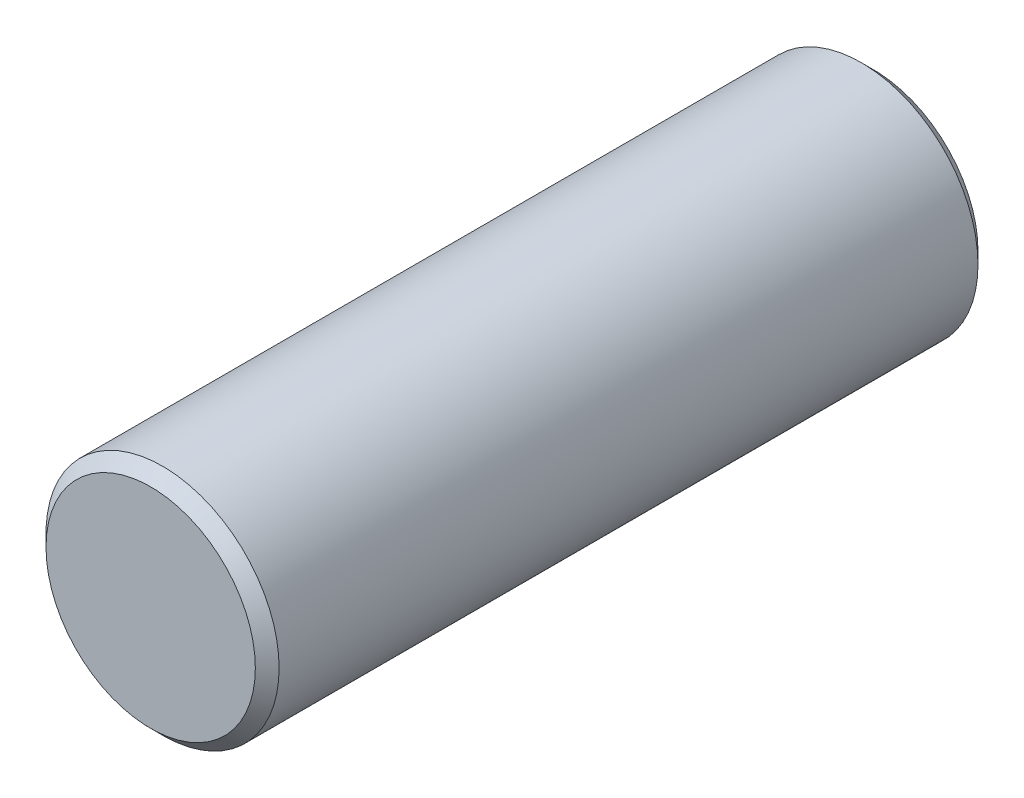
ISO-10303-21;
HEADER;
FILE_DESCRIPTION(('STEP AP214'),'2;1');
FILE_NAME('part.step','',(''),(''),'','','');
FILE_SCHEMA(('AUTOMOTIVE_DESIGN { 1 0 10303 214 1 1 1 1 }'));
ENDSEC;
DATA;
#1=APPLICATION_CONTEXT('core data for automotive mechanical design processes');
#2=APPLICATION_PROTOCOL_DEFINITION('international standard','automotive_design',2000,#1);
#3=PRODUCT_CONTEXT('',#1,'mechanical');
#4=PRODUCT('Part','Part','',(#3));
#5=PRODUCT_RELATED_PRODUCT_CATEGORY('part','',(#4));
#6=PRODUCT_DEFINITION_FORMATION('','',#4);
#7=PRODUCT_DEFINITION_CONTEXT('part definition',#1,'design');
#8=PRODUCT_DEFINITION('design','',#6,#7);
#9=PRODUCT_DEFINITION_SHAPE('','',#8);
#10=(LENGTH_UNIT() NAMED_UNIT(*) SI_UNIT(.MILLI.,.METRE.));
#11=(NAMED_UNIT(*) PLANE_ANGLE_UNIT() SI_UNIT($,.RADIAN.));
#12=(NAMED_UNIT(*) SI_UNIT($,.STERADIAN.) SOLID_ANGLE_UNIT());
#13=UNCERTAINTY_MEASURE_WITH_UNIT(LENGTH_MEASURE(1.E-05),#10,'distance_accuracy_value','');
#14=(GEOMETRIC_REPRESENTATION_CONTEXT(3) GLOBAL_UNCERTAINTY_ASSIGNED_CONTEXT((#13)) GLOBAL_UNIT_ASSIGNED_CONTEXT((#10,
#11,#12)) REPRESENTATION_CONTEXT('',''));
#15=CARTESIAN_POINT('',(0.,0.,0.));
#16=DIRECTION('',(0.,0.,1.));
#17=DIRECTION('',(1.,0.,0.));
#18=AXIS2_PLACEMENT_3D('',#15,#16,#17);
#19=CARTESIAN_POINT('',(0.,0.,15.5));
#20=DIRECTION('',(0.,0.,-1.));
#21=DIRECTION('',(-1.,0.,0.));
#22=AXIS2_PLACEMENT_3D('',#19,#20,#21);
#23=CYLINDRICAL_SURFACE('',#22,5.);
#24=CARTESIAN_POINT('',(0.,0.,-14.99));
#25=DIRECTION('',(0.,0.,1.));
#26=DIRECTION('',(1.,0.,0.));
#27=AXIS2_PLACEMENT_3D('',#24,#25,#26);
#28=CIRCLE('',#27,5.);
#29=CARTESIAN_POINT('',(5.,0.,-14.99));
#30=VERTEX_POINT('',#29);
#31=EDGE_CURVE('E59',#30,#30,#28,.T.);
#32=ORIENTED_EDGE('',*,*,#31,.T.);
#33=EDGE_LOOP('',(#32));
#34=FACE_BOUND('',#33,.T.);
#35=CARTESIAN_POINT('',(0.,0.,14.99));
#36=DIRECTION('',(0.,0.,1.));
#37=DIRECTION('',(1.,0.,0.));
#38=AXIS2_PLACEMENT_3D('',#35,#36,#37);
#39=CIRCLE('',#38,5.);
#40=CARTESIAN_POINT('',(5.,0.,14.99));
#41=VERTEX_POINT('',#40);
#42=EDGE_CURVE('E64',#41,#41,#39,.F.);
#43=ORIENTED_EDGE('',*,*,#42,.T.);
#44=EDGE_LOOP('',(#43));
#45=FACE_BOUND('',#44,.T.);
#46=ADVANCED_FACE('F45',(#34,#45),#23,.T.);
#47=CARTESIAN_POINT('',(0.,0.,15.5));
#48=DIRECTION('',(0.,0.,1.));
#49=DIRECTION('',(1.,0.,0.));
#50=AXIS2_PLACEMENT_3D('',#47,#48,#49);
#51=PLANE('',#50);
#52=CARTESIAN_POINT('',(0.,0.,15.5));
#53=DIRECTION('',(0.,0.,1.));
#54=DIRECTION('',(1.,0.,0.));
#55=AXIS2_PLACEMENT_3D('',#52,#53,#54);
#56=CIRCLE('',#55,4.49000000000001);
#57=CARTESIAN_POINT('',(4.49000000000001,0.,15.5));
#58=VERTEX_POINT('',#57);
#59=EDGE_CURVE('E10',#58,#58,#56,.T.);
#60=ORIENTED_EDGE('',*,*,#59,.T.);
#61=EDGE_LOOP('',(#60));
#62=FACE_BOUND('',#61,.T.);
#63=ADVANCED_FACE('F81',(#62),#51,.T.);
#64=CARTESIAN_POINT('',(0.,0.,-15.5));
#65=DIRECTION('',(0.,0.,1.));
#66=DIRECTION('',(1.,0.,0.));
#67=AXIS2_PLACEMENT_3D('',#64,#65,#66);
#68=PLANE('',#67);
#69=CARTESIAN_POINT('',(0.,0.,-15.5));
#70=DIRECTION('',(0.,0.,1.));
#71=DIRECTION('',(1.,0.,0.));
#72=AXIS2_PLACEMENT_3D('',#69,#70,#71);
#73=CIRCLE('',#72,4.49);
#74=CARTESIAN_POINT('',(4.49,0.,-15.5));
#75=VERTEX_POINT('',#74);
#76=EDGE_CURVE('E54',#75,#75,#73,.F.);
#77=ORIENTED_EDGE('',*,*,#76,.T.);
#78=EDGE_LOOP('',(#77));
#79=FACE_BOUND('',#78,.T.);
#80=ADVANCED_FACE('F78',(#79),#68,.F.);
#81=CARTESIAN_POINT('',(0.,0.,-14.99));
#82=DIRECTION('',(0.,0.,1.));
#83=DIRECTION('',(1.,0.,0.));
#84=AXIS2_PLACEMENT_3D('',#81,#82,#83);
#85=CONICAL_SURFACE('',#84,5.,0.785398163397451);
#86=ORIENTED_EDGE('',*,*,#76,.F.);
#87=EDGE_LOOP('',(#86));
#88=FACE_BOUND('',#87,.T.);
#89=ORIENTED_EDGE('',*,*,#31,.F.);
#90=EDGE_LOOP('',(#89));
#91=FACE_BOUND('',#90,.T.);
#92=ADVANCED_FACE('F74',(#88,#91),#85,.T.);
#93=CARTESIAN_POINT('',(0.,0.,15.5));
#94=DIRECTION('',(0.,0.,-1.));
#95=DIRECTION('',(-1.,0.,0.));
#96=AXIS2_PLACEMENT_3D('',#93,#94,#95);
#97=CONICAL_SURFACE('',#96,4.49000000000001,0.785398163397444);
#98=ORIENTED_EDGE('',*,*,#42,.F.);
#99=EDGE_LOOP('',(#98));
#100=FACE_BOUND('',#99,.T.);
#101=ORIENTED_EDGE('',*,*,#59,.F.);
#102=EDGE_LOOP('',(#101));
#103=FACE_BOUND('',#102,.T.);
#104=ADVANCED_FACE('F48',(#100,#103),#97,.T.);
#105=CLOSED_SHELL('',(#46,#63,#80,#92,#104));
#106=MANIFOLD_SOLID_BREP('B2',#105);
#107=ADVANCED_BREP_SHAPE_REPRESENTATION('',(#18,#106),#14);
#108=SHAPE_DEFINITION_REPRESENTATION(#9,#107);
ENDSEC;
END-ISO-10303-21;
